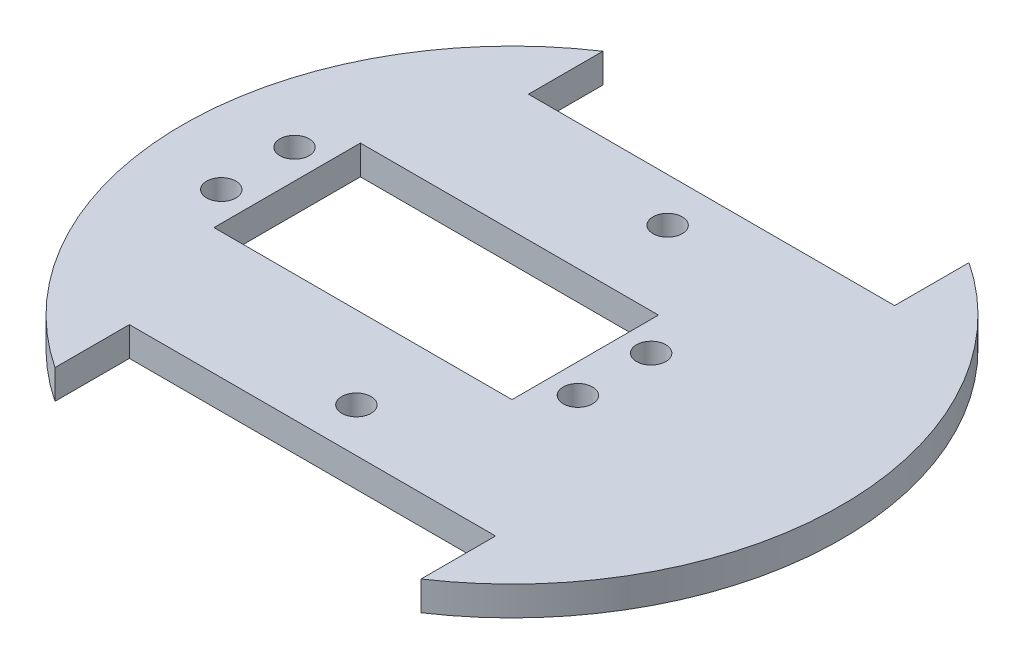
ISO-10303-21;
HEADER;
FILE_DESCRIPTION(('STEP AP214'),'2;1');
FILE_NAME('part.step','',(''),(''),'','','');
FILE_SCHEMA(('AUTOMOTIVE_DESIGN { 1 0 10303 214 1 1 1 1 }'));
ENDSEC;
DATA;
#1=APPLICATION_CONTEXT('core data for automotive mechanical design processes');
#2=APPLICATION_PROTOCOL_DEFINITION('international standard','automotive_design',2000,#1);
#3=PRODUCT_CONTEXT('',#1,'mechanical');
#4=PRODUCT('Part','Part','',(#3));
#5=PRODUCT_RELATED_PRODUCT_CATEGORY('part','',(#4));
#6=PRODUCT_DEFINITION_FORMATION('','',#4);
#7=PRODUCT_DEFINITION_CONTEXT('part definition',#1,'design');
#8=PRODUCT_DEFINITION('design','',#6,#7);
#9=PRODUCT_DEFINITION_SHAPE('','',#8);
#10=(LENGTH_UNIT() NAMED_UNIT(*) SI_UNIT(.MILLI.,.METRE.));
#11=(NAMED_UNIT(*) PLANE_ANGLE_UNIT() SI_UNIT($,.RADIAN.));
#12=(NAMED_UNIT(*) SI_UNIT($,.STERADIAN.) SOLID_ANGLE_UNIT());
#13=UNCERTAINTY_MEASURE_WITH_UNIT(LENGTH_MEASURE(1.E-05),#10,'distance_accuracy_value','');
#14=(GEOMETRIC_REPRESENTATION_CONTEXT(3) GLOBAL_UNCERTAINTY_ASSIGNED_CONTEXT((#13)) GLOBAL_UNIT_ASSIGNED_CONTEXT((#10,
#11,#12)) REPRESENTATION_CONTEXT('',''));
#15=CARTESIAN_POINT('',(0.,0.,0.));
#16=DIRECTION('',(0.,0.,1.));
#17=DIRECTION('',(1.,0.,0.));
#18=AXIS2_PLACEMENT_3D('',#15,#16,#17);
#19=CARTESIAN_POINT('',(0.,2.,0.));
#20=DIRECTION('',(0.,-1.,0.));
#21=DIRECTION('',(0.,0.,-1.));
#22=AXIS2_PLACEMENT_3D('',#19,#20,#21);
#23=CYLINDRICAL_SURFACE('',#22,45.);
#24=CARTESIAN_POINT('',(0.,-2.,0.));
#25=DIRECTION('',(0.,1.,0.));
#26=DIRECTION('',(0.,0.,1.));
#27=AXIS2_PLACEMENT_3D('',#24,#25,#26);
#28=CIRCLE('',#27,45.);
#29=CARTESIAN_POINT('',(25.,-2.,37.4165738677394));
#30=VERTEX_POINT('',#29);
#31=CARTESIAN_POINT('',(25.,-2.,-37.4165738677394));
#32=VERTEX_POINT('',#31);
#33=EDGE_CURVE('E182',#30,#32,#28,.T.);
#34=ORIENTED_EDGE('',*,*,#33,.T.);
#35=DIRECTION('',(0.,-1.,0.));
#36=VECTOR('',#35,1.);
#37=CARTESIAN_POINT('',(25.,2.,-37.4165738677394));
#38=LINE('',#37,#36);
#39=CARTESIAN_POINT('',(25.,2.,-37.4165738677394));
#40=VERTEX_POINT('',#39);
#41=EDGE_CURVE('E11',#40,#32,#38,.T.);
#42=ORIENTED_EDGE('',*,*,#41,.F.);
#43=CARTESIAN_POINT('',(0.,2.,0.));
#44=DIRECTION('',(0.,1.,0.));
#45=DIRECTION('',(0.,0.,1.));
#46=AXIS2_PLACEMENT_3D('',#43,#44,#45);
#47=CIRCLE('',#46,45.);
#48=CARTESIAN_POINT('',(25.,2.,37.4165738677394));
#49=VERTEX_POINT('',#48);
#50=EDGE_CURVE('E185',#49,#40,#47,.T.);
#51=ORIENTED_EDGE('',*,*,#50,.F.);
#52=DIRECTION('',(0.,-1.,0.));
#53=VECTOR('',#52,1.);
#54=CARTESIAN_POINT('',(25.,2.,37.4165738677394));
#55=LINE('',#54,#53);
#56=EDGE_CURVE('E203',#49,#30,#55,.T.);
#57=ORIENTED_EDGE('',*,*,#56,.T.);
#58=EDGE_LOOP('',(#34,#42,#51,#57));
#59=FACE_BOUND('',#58,.T.);
#60=ADVANCED_FACE('F32',(#59),#23,.T.);
#61=CARTESIAN_POINT('',(25.,2.,-37.4165738677394));
#62=DIRECTION('',(1.,0.,0.));
#63=DIRECTION('',(0.,0.,-1.));
#64=AXIS2_PLACEMENT_3D('',#61,#62,#63);
#65=PLANE('',#64);
#66=DIRECTION('',(0.,0.,1.));
#67=VECTOR('',#66,1.);
#68=CARTESIAN_POINT('',(25.,-2.,-37.4165738677394));
#69=LINE('',#68,#67);
#70=CARTESIAN_POINT('',(25.,-2.,-27.25));
#71=VERTEX_POINT('',#70);
#72=EDGE_CURVE('E206',#32,#71,#69,.T.);
#73=ORIENTED_EDGE('',*,*,#72,.T.);
#74=DIRECTION('',(0.,-1.,0.));
#75=VECTOR('',#74,1.);
#76=CARTESIAN_POINT('',(25.,2.,-27.25));
#77=LINE('',#76,#75);
#78=CARTESIAN_POINT('',(25.,2.,-27.25));
#79=VERTEX_POINT('',#78);
#80=EDGE_CURVE('E39',#79,#71,#77,.T.);
#81=ORIENTED_EDGE('',*,*,#80,.F.);
#82=DIRECTION('',(0.,0.,1.));
#83=VECTOR('',#82,1.);
#84=CARTESIAN_POINT('',(25.,2.,-37.4165738677394));
#85=LINE('',#84,#83);
#86=EDGE_CURVE('E188',#40,#79,#85,.T.);
#87=ORIENTED_EDGE('',*,*,#86,.F.);
#88=ORIENTED_EDGE('',*,*,#41,.T.);
#89=EDGE_LOOP('',(#73,#81,#87,#88));
#90=FACE_BOUND('',#89,.T.);
#91=ADVANCED_FACE('F262',(#90),#65,.F.);
#92=CARTESIAN_POINT('',(-25.,2.,-27.25));
#93=DIRECTION('',(0.,0.,1.));
#94=DIRECTION('',(1.,0.,0.));
#95=AXIS2_PLACEMENT_3D('',#92,#93,#94);
#96=PLANE('',#95);
#97=DIRECTION('',(-1.,0.,0.));
#98=VECTOR('',#97,1.);
#99=CARTESIAN_POINT('',(-25.,-2.,-27.25));
#100=LINE('',#99,#98);
#101=CARTESIAN_POINT('',(-25.,-2.,-27.25));
#102=VERTEX_POINT('',#101);
#103=EDGE_CURVE('E208',#71,#102,#100,.T.);
#104=ORIENTED_EDGE('',*,*,#103,.T.);
#105=DIRECTION('',(0.,-1.,0.));
#106=VECTOR('',#105,1.);
#107=CARTESIAN_POINT('',(-25.,2.,-27.25));
#108=LINE('',#107,#106);
#109=CARTESIAN_POINT('',(-25.,2.,-27.25));
#110=VERTEX_POINT('',#109);
#111=EDGE_CURVE('E233',#110,#102,#108,.T.);
#112=ORIENTED_EDGE('',*,*,#111,.F.);
#113=DIRECTION('',(-1.,0.,0.));
#114=VECTOR('',#113,1.);
#115=CARTESIAN_POINT('',(-25.,2.,-27.25));
#116=LINE('',#115,#114);
#117=EDGE_CURVE('E191',#79,#110,#116,.T.);
#118=ORIENTED_EDGE('',*,*,#117,.F.);
#119=ORIENTED_EDGE('',*,*,#80,.T.);
#120=EDGE_LOOP('',(#104,#112,#118,#119));
#121=FACE_BOUND('',#120,.T.);
#122=ADVANCED_FACE('F240',(#121),#96,.F.);
#123=CARTESIAN_POINT('',(-25.,2.,-37.4165738677394));
#124=DIRECTION('',(-1.,0.,0.));
#125=DIRECTION('',(0.,0.,1.));
#126=AXIS2_PLACEMENT_3D('',#123,#124,#125);
#127=PLANE('',#126);
#128=DIRECTION('',(0.,0.,-1.));
#129=VECTOR('',#128,1.);
#130=CARTESIAN_POINT('',(-25.,-2.,-37.4165738677394));
#131=LINE('',#130,#129);
#132=CARTESIAN_POINT('',(-25.,-2.,-37.4165738677394));
#133=VERTEX_POINT('',#132);
#134=EDGE_CURVE('E210',#102,#133,#131,.T.);
#135=ORIENTED_EDGE('',*,*,#134,.T.);
#136=DIRECTION('',(0.,-1.,0.));
#137=VECTOR('',#136,1.);
#138=CARTESIAN_POINT('',(-25.,2.,-37.4165738677394));
#139=LINE('',#138,#137);
#140=CARTESIAN_POINT('',(-25.,2.,-37.4165738677394));
#141=VERTEX_POINT('',#140);
#142=EDGE_CURVE('E230',#141,#133,#139,.T.);
#143=ORIENTED_EDGE('',*,*,#142,.F.);
#144=DIRECTION('',(0.,0.,-1.));
#145=VECTOR('',#144,1.);
#146=CARTESIAN_POINT('',(-25.,2.,-37.4165738677394));
#147=LINE('',#146,#145);
#148=EDGE_CURVE('E193',#110,#141,#147,.T.);
#149=ORIENTED_EDGE('',*,*,#148,.F.);
#150=ORIENTED_EDGE('',*,*,#111,.T.);
#151=EDGE_LOOP('',(#135,#143,#149,#150));
#152=FACE_BOUND('',#151,.T.);
#153=ADVANCED_FACE('F250',(#152),#127,.F.);
#154=CARTESIAN_POINT('',(0.,2.,0.));
#155=DIRECTION('',(0.,-1.,0.));
#156=DIRECTION('',(0.,0.,-1.));
#157=AXIS2_PLACEMENT_3D('',#154,#155,#156);
#158=CYLINDRICAL_SURFACE('',#157,45.);
#159=CARTESIAN_POINT('',(0.,-2.,0.));
#160=DIRECTION('',(0.,1.,0.));
#161=DIRECTION('',(0.,0.,1.));
#162=AXIS2_PLACEMENT_3D('',#159,#160,#161);
#163=CIRCLE('',#162,45.);
#164=CARTESIAN_POINT('',(-25.,-2.,37.4165738677394));
#165=VERTEX_POINT('',#164);
#166=EDGE_CURVE('E212',#133,#165,#163,.T.);
#167=ORIENTED_EDGE('',*,*,#166,.T.);
#168=DIRECTION('',(0.,-1.,0.));
#169=VECTOR('',#168,1.);
#170=CARTESIAN_POINT('',(-25.,2.,37.4165738677394));
#171=LINE('',#170,#169);
#172=CARTESIAN_POINT('',(-25.,2.,37.4165738677394));
#173=VERTEX_POINT('',#172);
#174=EDGE_CURVE('E227',#173,#165,#171,.T.);
#175=ORIENTED_EDGE('',*,*,#174,.F.);
#176=CARTESIAN_POINT('',(0.,2.,0.));
#177=DIRECTION('',(0.,1.,0.));
#178=DIRECTION('',(0.,0.,1.));
#179=AXIS2_PLACEMENT_3D('',#176,#177,#178);
#180=CIRCLE('',#179,45.);
#181=EDGE_CURVE('E195',#141,#173,#180,.T.);
#182=ORIENTED_EDGE('',*,*,#181,.F.);
#183=ORIENTED_EDGE('',*,*,#142,.T.);
#184=EDGE_LOOP('',(#167,#175,#182,#183));
#185=FACE_BOUND('',#184,.T.);
#186=ADVANCED_FACE('F254',(#185),#158,.T.);
#187=CARTESIAN_POINT('',(-25.,2.,37.4165738677394));
#188=DIRECTION('',(-1.,0.,0.));
#189=DIRECTION('',(0.,0.,1.));
#190=AXIS2_PLACEMENT_3D('',#187,#188,#189);
#191=PLANE('',#190);
#192=DIRECTION('',(0.,0.,-1.));
#193=VECTOR('',#192,1.);
#194=CARTESIAN_POINT('',(-25.,-2.,37.4165738677394));
#195=LINE('',#194,#193);
#196=CARTESIAN_POINT('',(-25.,-2.,27.25));
#197=VERTEX_POINT('',#196);
#198=EDGE_CURVE('E214',#165,#197,#195,.T.);
#199=ORIENTED_EDGE('',*,*,#198,.T.);
#200=DIRECTION('',(0.,-1.,0.));
#201=VECTOR('',#200,1.);
#202=CARTESIAN_POINT('',(-25.,2.,27.25));
#203=LINE('',#202,#201);
#204=CARTESIAN_POINT('',(-25.,2.,27.25));
#205=VERTEX_POINT('',#204);
#206=EDGE_CURVE('E224',#205,#197,#203,.T.);
#207=ORIENTED_EDGE('',*,*,#206,.F.);
#208=DIRECTION('',(0.,0.,-1.));
#209=VECTOR('',#208,1.);
#210=CARTESIAN_POINT('',(-25.,2.,37.4165738677394));
#211=LINE('',#210,#209);
#212=EDGE_CURVE('E197',#173,#205,#211,.T.);
#213=ORIENTED_EDGE('',*,*,#212,.F.);
#214=ORIENTED_EDGE('',*,*,#174,.T.);
#215=EDGE_LOOP('',(#199,#207,#213,#214));
#216=FACE_BOUND('',#215,.T.);
#217=ADVANCED_FACE('F275',(#216),#191,.F.);
#218=CARTESIAN_POINT('',(-25.,2.,27.25));
#219=DIRECTION('',(0.,0.,-1.));
#220=DIRECTION('',(-1.,0.,0.));
#221=AXIS2_PLACEMENT_3D('',#218,#219,#220);
#222=PLANE('',#221);
#223=DIRECTION('',(1.,0.,0.));
#224=VECTOR('',#223,1.);
#225=CARTESIAN_POINT('',(-25.,-2.,27.25));
#226=LINE('',#225,#224);
#227=CARTESIAN_POINT('',(25.,-2.,27.25));
#228=VERTEX_POINT('',#227);
#229=EDGE_CURVE('E216',#197,#228,#226,.T.);
#230=ORIENTED_EDGE('',*,*,#229,.T.);
#231=DIRECTION('',(0.,-1.,0.));
#232=VECTOR('',#231,1.);
#233=CARTESIAN_POINT('',(25.,2.,27.25));
#234=LINE('',#233,#232);
#235=CARTESIAN_POINT('',(25.,2.,27.25));
#236=VERTEX_POINT('',#235);
#237=EDGE_CURVE('E221',#236,#228,#234,.T.);
#238=ORIENTED_EDGE('',*,*,#237,.F.);
#239=DIRECTION('',(1.,0.,0.));
#240=VECTOR('',#239,1.);
#241=CARTESIAN_POINT('',(-25.,2.,27.25));
#242=LINE('',#241,#240);
#243=EDGE_CURVE('E199',#205,#236,#242,.T.);
#244=ORIENTED_EDGE('',*,*,#243,.F.);
#245=ORIENTED_EDGE('',*,*,#206,.T.);
#246=EDGE_LOOP('',(#230,#238,#244,#245));
#247=FACE_BOUND('',#246,.T.);
#248=ADVANCED_FACE('F273',(#247),#222,.F.);
#249=CARTESIAN_POINT('',(25.,2.,37.4165738677394));
#250=DIRECTION('',(1.,0.,0.));
#251=DIRECTION('',(0.,0.,-1.));
#252=AXIS2_PLACEMENT_3D('',#249,#250,#251);
#253=PLANE('',#252);
#254=DIRECTION('',(0.,0.,1.));
#255=VECTOR('',#254,1.);
#256=CARTESIAN_POINT('',(25.,-2.,37.4165738677394));
#257=LINE('',#256,#255);
#258=EDGE_CURVE('E189',#228,#30,#257,.T.);
#259=ORIENTED_EDGE('',*,*,#258,.T.);
#260=ORIENTED_EDGE('',*,*,#56,.F.);
#261=DIRECTION('',(0.,0.,1.));
#262=VECTOR('',#261,1.);
#263=CARTESIAN_POINT('',(25.,2.,37.4165738677394));
#264=LINE('',#263,#262);
#265=EDGE_CURVE('E201',#236,#49,#264,.T.);
#266=ORIENTED_EDGE('',*,*,#265,.F.);
#267=ORIENTED_EDGE('',*,*,#237,.T.);
#268=EDGE_LOOP('',(#259,#260,#266,#267));
#269=FACE_BOUND('',#268,.T.);
#270=ADVANCED_FACE('F268',(#269),#253,.F.);
#271=CARTESIAN_POINT('',(0.,2.,0.));
#272=DIRECTION('',(0.,1.,0.));
#273=DIRECTION('',(0.,0.,1.));
#274=AXIS2_PLACEMENT_3D('',#271,#272,#273);
#275=PLANE('',#274);
#276=CARTESIAN_POINT('',(0.,2.,21.25));
#277=DIRECTION('',(0.,1.,0.));
#278=DIRECTION('',(0.,0.,1.));
#279=AXIS2_PLACEMENT_3D('',#276,#277,#278);
#280=CIRCLE('',#279,2.);
#281=CARTESIAN_POINT('',(0.,2.,23.25));
#282=VERTEX_POINT('',#281);
#283=EDGE_CURVE('E443',#282,#282,#280,.T.);
#284=ORIENTED_EDGE('',*,*,#283,.F.);
#285=EDGE_LOOP('',(#284));
#286=FACE_BOUND('',#285,.T.);
#287=CARTESIAN_POINT('',(0.,2.,-21.25));
#288=DIRECTION('',(0.,1.,0.));
#289=DIRECTION('',(0.,0.,1.));
#290=AXIS2_PLACEMENT_3D('',#287,#288,#289);
#291=CIRCLE('',#290,2.);
#292=CARTESIAN_POINT('',(0.,2.,-19.25));
#293=VERTEX_POINT('',#292);
#294=EDGE_CURVE('E144',#293,#293,#291,.T.);
#295=ORIENTED_EDGE('',*,*,#294,.F.);
#296=EDGE_LOOP('',(#295));
#297=FACE_BOUND('',#296,.T.);
#298=DIRECTION('',(0.,0.,1.));
#299=VECTOR('',#298,1.);
#300=CARTESIAN_POINT('',(-30.7,2.,-10.));
#301=LINE('',#300,#299);
#302=CARTESIAN_POINT('',(-30.7,2.,-10.));
#303=VERTEX_POINT('',#302);
#304=CARTESIAN_POINT('',(-30.7,2.,9.99999999999996));
#305=VERTEX_POINT('',#304);
#306=EDGE_CURVE('E46',#303,#305,#301,.T.);
#307=ORIENTED_EDGE('',*,*,#306,.F.);
#308=DIRECTION('',(-1.,0.,0.));
#309=VECTOR('',#308,1.);
#310=CARTESIAN_POINT('',(-30.7,2.,-10.));
#311=LINE('',#310,#309);
#312=CARTESIAN_POINT('',(9.99999999999999,2.,-10.));
#313=VERTEX_POINT('',#312);
#314=EDGE_CURVE('E138',#313,#303,#311,.T.);
#315=ORIENTED_EDGE('',*,*,#314,.F.);
#316=DIRECTION('',(0.,0.,-1.));
#317=VECTOR('',#316,1.);
#318=CARTESIAN_POINT('',(9.99999999999999,2.,-10.));
#319=LINE('',#318,#317);
#320=CARTESIAN_POINT('',(9.99999999999999,2.,9.99999999999996));
#321=VERTEX_POINT('',#320);
#322=EDGE_CURVE('E141',#321,#313,#319,.T.);
#323=ORIENTED_EDGE('',*,*,#322,.F.);
#324=DIRECTION('',(1.,0.,0.));
#325=VECTOR('',#324,1.);
#326=CARTESIAN_POINT('',(-30.7,2.,9.99999999999996));
#327=LINE('',#326,#325);
#328=EDGE_CURVE('E150',#305,#321,#327,.T.);
#329=ORIENTED_EDGE('',*,*,#328,.F.);
#330=EDGE_LOOP('',(#307,#315,#323,#329));
#331=FACE_BOUND('',#330,.T.);
#332=CARTESIAN_POINT('',(14.,2.,4.99999999999995));
#333=DIRECTION('',(0.,1.,0.));
#334=DIRECTION('',(0.,0.,1.));
#335=AXIS2_PLACEMENT_3D('',#332,#333,#334);
#336=CIRCLE('',#335,2.);
#337=CARTESIAN_POINT('',(14.,2.,6.99999999999996));
#338=VERTEX_POINT('',#337);
#339=EDGE_CURVE('E157',#338,#338,#336,.T.);
#340=ORIENTED_EDGE('',*,*,#339,.F.);
#341=EDGE_LOOP('',(#340));
#342=FACE_BOUND('',#341,.T.);
#343=CARTESIAN_POINT('',(14.,2.,-5.00000000000005));
#344=DIRECTION('',(0.,1.,0.));
#345=DIRECTION('',(0.,0.,1.));
#346=AXIS2_PLACEMENT_3D('',#343,#344,#345);
#347=CIRCLE('',#346,2.);
#348=CARTESIAN_POINT('',(14.,2.,-3.00000000000005));
#349=VERTEX_POINT('',#348);
#350=EDGE_CURVE('E164',#349,#349,#347,.T.);
#351=ORIENTED_EDGE('',*,*,#350,.F.);
#352=EDGE_LOOP('',(#351));
#353=FACE_BOUND('',#352,.T.);
#354=CARTESIAN_POINT('',(-34.7,2.,4.99999999999995));
#355=DIRECTION('',(0.,1.,0.));
#356=DIRECTION('',(0.,0.,1.));
#357=AXIS2_PLACEMENT_3D('',#354,#355,#356);
#358=CIRCLE('',#357,2.);
#359=CARTESIAN_POINT('',(-34.7,2.,6.99999999999996));
#360=VERTEX_POINT('',#359);
#361=EDGE_CURVE('E170',#360,#360,#358,.T.);
#362=ORIENTED_EDGE('',*,*,#361,.F.);
#363=EDGE_LOOP('',(#362));
#364=FACE_BOUND('',#363,.T.);
#365=CARTESIAN_POINT('',(-34.7,2.,-5.00000000000005));
#366=DIRECTION('',(0.,1.,0.));
#367=DIRECTION('',(0.,0.,1.));
#368=AXIS2_PLACEMENT_3D('',#365,#366,#367);
#369=CIRCLE('',#368,2.);
#370=CARTESIAN_POINT('',(-34.7,2.,-3.00000000000005));
#371=VERTEX_POINT('',#370);
#372=EDGE_CURVE('E176',#371,#371,#369,.T.);
#373=ORIENTED_EDGE('',*,*,#372,.F.);
#374=EDGE_LOOP('',(#373));
#375=FACE_BOUND('',#374,.T.);
#376=ORIENTED_EDGE('',*,*,#50,.T.);
#377=ORIENTED_EDGE('',*,*,#86,.T.);
#378=ORIENTED_EDGE('',*,*,#117,.T.);
#379=ORIENTED_EDGE('',*,*,#148,.T.);
#380=ORIENTED_EDGE('',*,*,#181,.T.);
#381=ORIENTED_EDGE('',*,*,#212,.T.);
#382=ORIENTED_EDGE('',*,*,#243,.T.);
#383=ORIENTED_EDGE('',*,*,#265,.T.);
#384=EDGE_LOOP('',(#376,#377,#378,#379,#380,#381,#382,#383));
#385=FACE_BOUND('',#384,.T.);
#386=ADVANCED_FACE('F258',(#286,#297,#331,#342,#353,#364,#375,#385),#275,.T.);
#387=CARTESIAN_POINT('',(0.,-2.,0.));
#388=DIRECTION('',(0.,1.,0.));
#389=DIRECTION('',(0.,0.,1.));
#390=AXIS2_PLACEMENT_3D('',#387,#388,#389);
#391=PLANE('',#390);
#392=CARTESIAN_POINT('',(0.,-2.,21.25));
#393=DIRECTION('',(0.,1.,0.));
#394=DIRECTION('',(0.,0.,1.));
#395=AXIS2_PLACEMENT_3D('',#392,#393,#394);
#396=CIRCLE('',#395,2.);
#397=CARTESIAN_POINT('',(0.,-2.,23.25));
#398=VERTEX_POINT('',#397);
#399=EDGE_CURVE('E440',#398,#398,#396,.T.);
#400=ORIENTED_EDGE('',*,*,#399,.T.);
#401=EDGE_LOOP('',(#400));
#402=FACE_BOUND('',#401,.T.);
#403=CARTESIAN_POINT('',(0.,-2.,-21.25));
#404=DIRECTION('',(0.,1.,0.));
#405=DIRECTION('',(0.,0.,1.));
#406=AXIS2_PLACEMENT_3D('',#403,#404,#405);
#407=CIRCLE('',#406,2.);
#408=CARTESIAN_POINT('',(0.,-2.,-19.25));
#409=VERTEX_POINT('',#408);
#410=EDGE_CURVE('E151',#409,#409,#407,.T.);
#411=ORIENTED_EDGE('',*,*,#410,.T.);
#412=EDGE_LOOP('',(#411));
#413=FACE_BOUND('',#412,.T.);
#414=DIRECTION('',(-1.,0.,0.));
#415=VECTOR('',#414,1.);
#416=CARTESIAN_POINT('',(-30.7,-2.,-10.));
#417=LINE('',#416,#415);
#418=CARTESIAN_POINT('',(9.99999999999999,-2.,-10.));
#419=VERTEX_POINT('',#418);
#420=CARTESIAN_POINT('',(-30.7,-2.,-10.));
#421=VERTEX_POINT('',#420);
#422=EDGE_CURVE('E128',#419,#421,#417,.T.);
#423=ORIENTED_EDGE('',*,*,#422,.T.);
#424=DIRECTION('',(0.,0.,1.));
#425=VECTOR('',#424,1.);
#426=CARTESIAN_POINT('',(-30.7,-2.,-10.));
#427=LINE('',#426,#425);
#428=CARTESIAN_POINT('',(-30.7,-2.,9.99999999999996));
#429=VERTEX_POINT('',#428);
#430=EDGE_CURVE('E122',#421,#429,#427,.T.);
#431=ORIENTED_EDGE('',*,*,#430,.T.);
#432=DIRECTION('',(1.,0.,0.));
#433=VECTOR('',#432,1.);
#434=CARTESIAN_POINT('',(-30.7,-2.,9.99999999999996));
#435=LINE('',#434,#433);
#436=CARTESIAN_POINT('',(9.99999999999999,-2.,9.99999999999996));
#437=VERTEX_POINT('',#436);
#438=EDGE_CURVE('E131',#429,#437,#435,.T.);
#439=ORIENTED_EDGE('',*,*,#438,.T.);
#440=DIRECTION('',(0.,0.,-1.));
#441=VECTOR('',#440,1.);
#442=CARTESIAN_POINT('',(9.99999999999999,-2.,-10.));
#443=LINE('',#442,#441);
#444=EDGE_CURVE('E54',#437,#419,#443,.T.);
#445=ORIENTED_EDGE('',*,*,#444,.T.);
#446=EDGE_LOOP('',(#423,#431,#439,#445));
#447=FACE_BOUND('',#446,.T.);
#448=CARTESIAN_POINT('',(14.,-2.,4.99999999999995));
#449=DIRECTION('',(0.,1.,0.));
#450=DIRECTION('',(0.,0.,1.));
#451=AXIS2_PLACEMENT_3D('',#448,#449,#450);
#452=CIRCLE('',#451,2.);
#453=CARTESIAN_POINT('',(14.,-2.,6.99999999999996));
#454=VERTEX_POINT('',#453);
#455=EDGE_CURVE('E161',#454,#454,#452,.T.);
#456=ORIENTED_EDGE('',*,*,#455,.T.);
#457=EDGE_LOOP('',(#456));
#458=FACE_BOUND('',#457,.T.);
#459=CARTESIAN_POINT('',(14.,-2.,-5.00000000000005));
#460=DIRECTION('',(0.,1.,0.));
#461=DIRECTION('',(0.,0.,1.));
#462=AXIS2_PLACEMENT_3D('',#459,#460,#461);
#463=CIRCLE('',#462,2.);
#464=CARTESIAN_POINT('',(14.,-2.,-3.00000000000005));
#465=VERTEX_POINT('',#464);
#466=EDGE_CURVE('E167',#465,#465,#463,.T.);
#467=ORIENTED_EDGE('',*,*,#466,.T.);
#468=EDGE_LOOP('',(#467));
#469=FACE_BOUND('',#468,.T.);
#470=CARTESIAN_POINT('',(-34.7,-2.,4.99999999999995));
#471=DIRECTION('',(0.,1.,0.));
#472=DIRECTION('',(0.,0.,1.));
#473=AXIS2_PLACEMENT_3D('',#470,#471,#472);
#474=CIRCLE('',#473,2.);
#475=CARTESIAN_POINT('',(-34.7,-2.,6.99999999999996));
#476=VERTEX_POINT('',#475);
#477=EDGE_CURVE('E173',#476,#476,#474,.T.);
#478=ORIENTED_EDGE('',*,*,#477,.T.);
#479=EDGE_LOOP('',(#478));
#480=FACE_BOUND('',#479,.T.);
#481=CARTESIAN_POINT('',(-34.7,-2.,-5.00000000000005));
#482=DIRECTION('',(0.,1.,0.));
#483=DIRECTION('',(0.,0.,1.));
#484=AXIS2_PLACEMENT_3D('',#481,#482,#483);
#485=CIRCLE('',#484,2.);
#486=CARTESIAN_POINT('',(-34.7,-2.,-3.00000000000005));
#487=VERTEX_POINT('',#486);
#488=EDGE_CURVE('E179',#487,#487,#485,.T.);
#489=ORIENTED_EDGE('',*,*,#488,.T.);
#490=EDGE_LOOP('',(#489));
#491=FACE_BOUND('',#490,.T.);
#492=ORIENTED_EDGE('',*,*,#33,.F.);
#493=ORIENTED_EDGE('',*,*,#258,.F.);
#494=ORIENTED_EDGE('',*,*,#229,.F.);
#495=ORIENTED_EDGE('',*,*,#198,.F.);
#496=ORIENTED_EDGE('',*,*,#166,.F.);
#497=ORIENTED_EDGE('',*,*,#134,.F.);
#498=ORIENTED_EDGE('',*,*,#103,.F.);
#499=ORIENTED_EDGE('',*,*,#72,.F.);
#500=EDGE_LOOP('',(#492,#493,#494,#495,#496,#497,#498,#499));
#501=FACE_BOUND('',#500,.T.);
#502=ADVANCED_FACE('F135',(#402,#413,#447,#458,#469,#480,#491,#501),#391,.F.);
#503=CARTESIAN_POINT('',(-34.7,-2.,-5.00000000000005));
#504=DIRECTION('',(0.,1.,0.));
#505=DIRECTION('',(0.,0.,1.));
#506=AXIS2_PLACEMENT_3D('',#503,#504,#505);
#507=CYLINDRICAL_SURFACE('',#506,2.);
#508=ORIENTED_EDGE('',*,*,#488,.F.);
#509=EDGE_LOOP('',(#508));
#510=FACE_BOUND('',#509,.T.);
#511=ORIENTED_EDGE('',*,*,#372,.T.);
#512=EDGE_LOOP('',(#511));
#513=FACE_BOUND('',#512,.T.);
#514=ADVANCED_FACE('F338',(#510,#513),#507,.F.);
#515=CARTESIAN_POINT('',(-34.7,-2.,4.99999999999995));
#516=DIRECTION('',(0.,1.,0.));
#517=DIRECTION('',(0.,0.,1.));
#518=AXIS2_PLACEMENT_3D('',#515,#516,#517);
#519=CYLINDRICAL_SURFACE('',#518,2.);
#520=ORIENTED_EDGE('',*,*,#477,.F.);
#521=EDGE_LOOP('',(#520));
#522=FACE_BOUND('',#521,.T.);
#523=ORIENTED_EDGE('',*,*,#361,.T.);
#524=EDGE_LOOP('',(#523));
#525=FACE_BOUND('',#524,.T.);
#526=ADVANCED_FACE('F348',(#522,#525),#519,.F.);
#527=CARTESIAN_POINT('',(14.,-2.,-5.00000000000005));
#528=DIRECTION('',(0.,1.,0.));
#529=DIRECTION('',(0.,0.,1.));
#530=AXIS2_PLACEMENT_3D('',#527,#528,#529);
#531=CYLINDRICAL_SURFACE('',#530,2.);
#532=ORIENTED_EDGE('',*,*,#466,.F.);
#533=EDGE_LOOP('',(#532));
#534=FACE_BOUND('',#533,.T.);
#535=ORIENTED_EDGE('',*,*,#350,.T.);
#536=EDGE_LOOP('',(#535));
#537=FACE_BOUND('',#536,.T.);
#538=ADVANCED_FACE('F358',(#534,#537),#531,.F.);
#539=CARTESIAN_POINT('',(14.,-2.,4.99999999999995));
#540=DIRECTION('',(0.,1.,0.));
#541=DIRECTION('',(0.,0.,1.));
#542=AXIS2_PLACEMENT_3D('',#539,#540,#541);
#543=CYLINDRICAL_SURFACE('',#542,2.);
#544=ORIENTED_EDGE('',*,*,#455,.F.);
#545=EDGE_LOOP('',(#544));
#546=FACE_BOUND('',#545,.T.);
#547=ORIENTED_EDGE('',*,*,#339,.T.);
#548=EDGE_LOOP('',(#547));
#549=FACE_BOUND('',#548,.T.);
#550=ADVANCED_FACE('F368',(#546,#549),#543,.F.);
#551=CARTESIAN_POINT('',(-30.7,-2.,-10.));
#552=DIRECTION('',(-1.,0.,0.));
#553=DIRECTION('',(0.,0.,1.));
#554=AXIS2_PLACEMENT_3D('',#551,#552,#553);
#555=PLANE('',#554);
#556=ORIENTED_EDGE('',*,*,#306,.T.);
#557=DIRECTION('',(0.,1.,0.));
#558=VECTOR('',#557,1.);
#559=CARTESIAN_POINT('',(-30.7,-2.,9.99999999999996));
#560=LINE('',#559,#558);
#561=EDGE_CURVE('E118',#429,#305,#560,.T.);
#562=ORIENTED_EDGE('',*,*,#561,.F.);
#563=ORIENTED_EDGE('',*,*,#430,.F.);
#564=DIRECTION('',(0.,1.,0.));
#565=VECTOR('',#564,1.);
#566=CARTESIAN_POINT('',(-30.7,-2.,-10.));
#567=LINE('',#566,#565);
#568=EDGE_CURVE('E155',#421,#303,#567,.T.);
#569=ORIENTED_EDGE('',*,*,#568,.T.);
#570=EDGE_LOOP('',(#556,#562,#563,#569));
#571=FACE_BOUND('',#570,.T.);
#572=ADVANCED_FACE('F120',(#571),#555,.F.);
#573=CARTESIAN_POINT('',(-30.7,-2.,-10.));
#574=DIRECTION('',(0.,0.,-1.));
#575=DIRECTION('',(-1.,0.,0.));
#576=AXIS2_PLACEMENT_3D('',#573,#574,#575);
#577=PLANE('',#576);
#578=ORIENTED_EDGE('',*,*,#314,.T.);
#579=ORIENTED_EDGE('',*,*,#568,.F.);
#580=ORIENTED_EDGE('',*,*,#422,.F.);
#581=DIRECTION('',(0.,1.,0.));
#582=VECTOR('',#581,1.);
#583=CARTESIAN_POINT('',(9.99999999999999,-2.,-10.));
#584=LINE('',#583,#582);
#585=EDGE_CURVE('E158',#419,#313,#584,.T.);
#586=ORIENTED_EDGE('',*,*,#585,.T.);
#587=EDGE_LOOP('',(#578,#579,#580,#586));
#588=FACE_BOUND('',#587,.T.);
#589=ADVANCED_FACE('F387',(#588),#577,.F.);
#590=CARTESIAN_POINT('',(9.99999999999999,-2.,-10.));
#591=DIRECTION('',(1.,0.,0.));
#592=DIRECTION('',(0.,0.,-1.));
#593=AXIS2_PLACEMENT_3D('',#590,#591,#592);
#594=PLANE('',#593);
#595=ORIENTED_EDGE('',*,*,#322,.T.);
#596=ORIENTED_EDGE('',*,*,#585,.F.);
#597=ORIENTED_EDGE('',*,*,#444,.F.);
#598=DIRECTION('',(0.,1.,0.));
#599=VECTOR('',#598,1.);
#600=CARTESIAN_POINT('',(9.99999999999999,-2.,9.99999999999996));
#601=LINE('',#600,#599);
#602=EDGE_CURVE('E127',#437,#321,#601,.T.);
#603=ORIENTED_EDGE('',*,*,#602,.T.);
#604=EDGE_LOOP('',(#595,#596,#597,#603));
#605=FACE_BOUND('',#604,.T.);
#606=ADVANCED_FACE('F396',(#605),#594,.F.);
#607=CARTESIAN_POINT('',(-30.7,-2.,9.99999999999996));
#608=DIRECTION('',(0.,0.,1.));
#609=DIRECTION('',(1.,0.,0.));
#610=AXIS2_PLACEMENT_3D('',#607,#608,#609);
#611=PLANE('',#610);
#612=ORIENTED_EDGE('',*,*,#328,.T.);
#613=ORIENTED_EDGE('',*,*,#602,.F.);
#614=ORIENTED_EDGE('',*,*,#438,.F.);
#615=ORIENTED_EDGE('',*,*,#561,.T.);
#616=EDGE_LOOP('',(#612,#613,#614,#615));
#617=FACE_BOUND('',#616,.T.);
#618=ADVANCED_FACE('F132',(#617),#611,.F.);
#619=CARTESIAN_POINT('',(0.,-2.,-21.25));
#620=DIRECTION('',(0.,1.,0.));
#621=DIRECTION('',(0.,0.,1.));
#622=AXIS2_PLACEMENT_3D('',#619,#620,#621);
#623=CYLINDRICAL_SURFACE('',#622,2.);
#624=ORIENTED_EDGE('',*,*,#410,.F.);
#625=EDGE_LOOP('',(#624));
#626=FACE_BOUND('',#625,.T.);
#627=ORIENTED_EDGE('',*,*,#294,.T.);
#628=EDGE_LOOP('',(#627));
#629=FACE_BOUND('',#628,.T.);
#630=ADVANCED_FACE('F414',(#626,#629),#623,.F.);
#631=CARTESIAN_POINT('',(0.,-2.,21.25));
#632=DIRECTION('',(0.,1.,0.));
#633=DIRECTION('',(0.,0.,1.));
#634=AXIS2_PLACEMENT_3D('',#631,#632,#633);
#635=CYLINDRICAL_SURFACE('',#634,2.);
#636=ORIENTED_EDGE('',*,*,#399,.F.);
#637=EDGE_LOOP('',(#636));
#638=FACE_BOUND('',#637,.T.);
#639=ORIENTED_EDGE('',*,*,#283,.T.);
#640=EDGE_LOOP('',(#639));
#641=FACE_BOUND('',#640,.T.);
#642=ADVANCED_FACE('F423',(#638,#641),#635,.F.);
#643=CLOSED_SHELL('',(#60,#91,#122,#153,#186,#217,#248,#270,#386,#502,#514,#526,#538,#550,#572,
#589,#606,#618,#630,#642));
#644=MANIFOLD_SOLID_BREP('B2',#643);
#645=ADVANCED_BREP_SHAPE_REPRESENTATION('',(#18,#644),#14);
#646=SHAPE_DEFINITION_REPRESENTATION(#9,#645);
ENDSEC;
END-ISO-10303-21;
